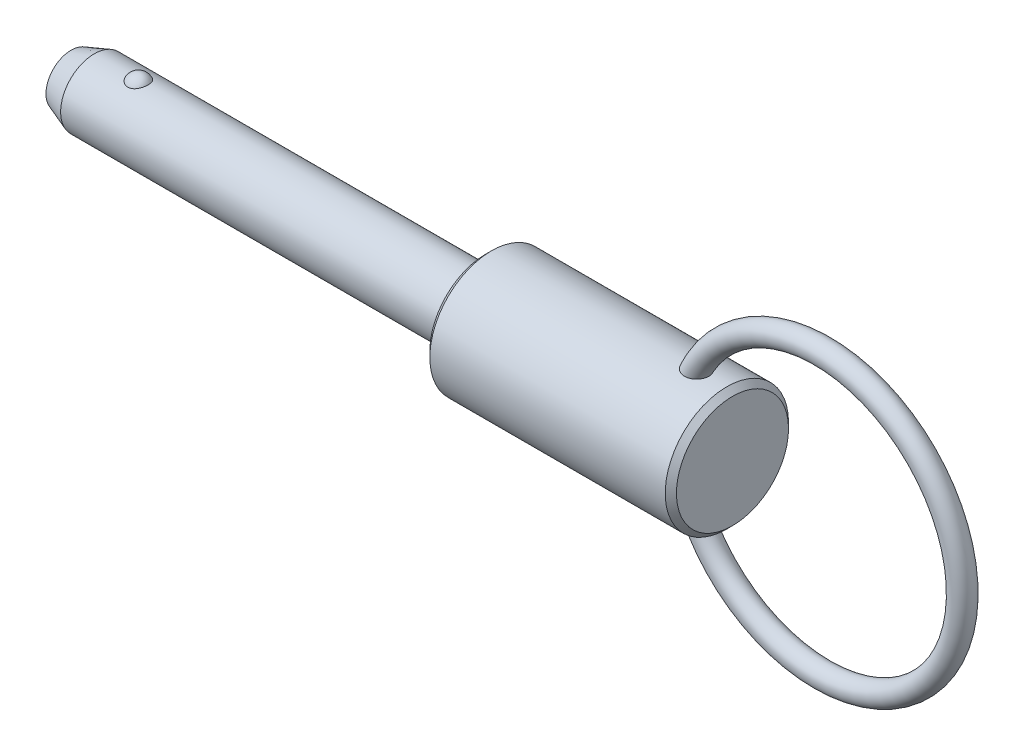
ISO-10303-21;
HEADER;
FILE_DESCRIPTION(('STEP AP214'),'2;1');
FILE_NAME('part.step','',(''),(''),'','','');
FILE_SCHEMA(('AUTOMOTIVE_DESIGN { 1 0 10303 214 1 1 1 1 }'));
ENDSEC;
DATA;
#1=APPLICATION_CONTEXT('core data for automotive mechanical design processes');
#2=APPLICATION_PROTOCOL_DEFINITION('international standard','automotive_design',2000,#1);
#3=PRODUCT_CONTEXT('',#1,'mechanical');
#4=PRODUCT('Part','Part','',(#3));
#5=PRODUCT_RELATED_PRODUCT_CATEGORY('part','',(#4));
#6=PRODUCT_DEFINITION_FORMATION('','',#4);
#7=PRODUCT_DEFINITION_CONTEXT('part definition',#1,'design');
#8=PRODUCT_DEFINITION('design','',#6,#7);
#9=PRODUCT_DEFINITION_SHAPE('','',#8);
#10=(LENGTH_UNIT() NAMED_UNIT(*) SI_UNIT(.MILLI.,.METRE.));
#11=(NAMED_UNIT(*) PLANE_ANGLE_UNIT() SI_UNIT($,.RADIAN.));
#12=(NAMED_UNIT(*) SI_UNIT($,.STERADIAN.) SOLID_ANGLE_UNIT());
#13=UNCERTAINTY_MEASURE_WITH_UNIT(LENGTH_MEASURE(1.E-05),#10,'distance_accuracy_value','');
#14=(GEOMETRIC_REPRESENTATION_CONTEXT(3) GLOBAL_UNCERTAINTY_ASSIGNED_CONTEXT((#13)) GLOBAL_UNIT_ASSIGNED_CONTEXT((#10,
#11,#12)) REPRESENTATION_CONTEXT('',''));
#15=CARTESIAN_POINT('',(0.,0.,0.));
#16=DIRECTION('',(0.,0.,1.));
#17=DIRECTION('',(1.,0.,0.));
#18=AXIS2_PLACEMENT_3D('',#15,#16,#17);
#19=CARTESIAN_POINT('',(-37.,0.,0.));
#20=DIRECTION('',(1.,0.,0.));
#21=DIRECTION('',(0.,0.,-1.));
#22=AXIS2_PLACEMENT_3D('',#19,#20,#21);
#23=PLANE('',#22);
#24=CARTESIAN_POINT('',(-37.,0.,0.));
#25=DIRECTION('',(1.,0.,0.));
#26=DIRECTION('',(0.,0.,-1.));
#27=AXIS2_PLACEMENT_3D('',#24,#25,#26);
#28=CIRCLE('',#27,2.25);
#29=CARTESIAN_POINT('',(-37.,0.,-2.25));
#30=VERTEX_POINT('',#29);
#31=EDGE_CURVE('E65',#30,#30,#28,.T.);
#32=ORIENTED_EDGE('',*,*,#31,.F.);
#33=EDGE_LOOP('',(#32));
#34=FACE_BOUND('',#33,.T.);
#35=ADVANCED_FACE('F15',(#34),#23,.F.);
#36=CARTESIAN_POINT('',(-37.,0.,0.));
#37=DIRECTION('',(1.,0.,0.));
#38=DIRECTION('',(0.,0.,-1.));
#39=AXIS2_PLACEMENT_3D('',#36,#37,#38);
#40=CONICAL_SURFACE('',#39,2.25,0.349065850398866);
#41=CARTESIAN_POINT('',(-34.939391935409,0.,0.));
#42=DIRECTION('',(1.,0.,0.));
#43=DIRECTION('',(0.,0.,-1.));
#44=AXIS2_PLACEMENT_3D('',#41,#42,#43);
#45=CIRCLE('',#44,3.);
#46=CARTESIAN_POINT('',(-34.939391935409,0.,-3.));
#47=VERTEX_POINT('',#46);
#48=EDGE_CURVE('E85',#47,#47,#45,.T.);
#49=ORIENTED_EDGE('',*,*,#48,.F.);
#50=EDGE_LOOP('',(#49));
#51=FACE_BOUND('',#50,.T.);
#52=ORIENTED_EDGE('',*,*,#31,.T.);
#53=EDGE_LOOP('',(#52));
#54=FACE_BOUND('',#53,.T.);
#55=ADVANCED_FACE('F72',(#51,#54),#40,.T.);
#56=CARTESIAN_POINT('',(22.,0.,0.));
#57=DIRECTION('',(1.,0.,0.));
#58=DIRECTION('',(0.,0.,-1.));
#59=AXIS2_PLACEMENT_3D('',#56,#57,#58);
#60=CYLINDRICAL_SURFACE('',#59,2.99999999999999);
#61=CARTESIAN_POINT('',(0.,0.,0.));
#62=DIRECTION('',(1.,0.,0.));
#63=DIRECTION('',(0.,0.,-1.));
#64=AXIS2_PLACEMENT_3D('',#61,#62,#63);
#65=CIRCLE('',#64,2.99999999999999);
#66=CARTESIAN_POINT('',(0.,0.,-2.99999999999999));
#67=VERTEX_POINT('',#66);
#68=EDGE_CURVE('E88',#67,#67,#65,.T.);
#69=ORIENTED_EDGE('',*,*,#68,.F.);
#70=EDGE_LOOP('',(#69));
#71=FACE_BOUND('',#70,.T.);
#72=CARTESIAN_POINT('',(-30.1339745906775,3.00000000959214,0.));
#73=CARTESIAN_POINT('',(-30.1339750053791,2.9999995944216,0.0546556941744972));
#74=CARTESIAN_POINT('',(-30.1382914700072,2.99849333498199,0.109316280803024));
#75=CARTESIAN_POINT('',(-30.1555039485116,2.99262007211818,0.21711923146495));
#76=CARTESIAN_POINT('',(-30.1684010618357,2.98825270209795,0.270261400031665));
#77=CARTESIAN_POINT('',(-30.2026150718712,2.97710614168701,0.373550581541127));
#78=CARTESIAN_POINT('',(-30.2239387204412,2.97032501768161,0.423695155441631));
#79=CARTESIAN_POINT('',(-30.2746900711123,2.95508653269725,0.519436838880394));
#80=CARTESIAN_POINT('',(-30.304117643963,2.94662919845294,0.565034020929694));
#81=CARTESIAN_POINT('',(-30.3699167443118,2.92918923042513,0.649362280163123));
#82=CARTESIAN_POINT('',(-30.4061432870326,2.92021988571971,0.688208891821342));
#83=CARTESIAN_POINT('',(-30.4851370742032,2.90270603776341,0.758695973504806));
#84=CARTESIAN_POINT('',(-30.5279017612583,2.89416137012429,0.790339249121105));
#85=CARTESIAN_POINT('',(-30.6159001251152,2.87914525485122,0.843347824649814));
#86=CARTESIAN_POINT('',(-30.6607959901828,2.87257555352632,0.865244914041042));
#87=CARTESIAN_POINT('',(-30.7540272111864,2.86166763399681,0.900669880151301));
#88=CARTESIAN_POINT('',(-30.8023602655013,2.85732793825144,0.914203299617403));
#89=CARTESIAN_POINT('',(-30.8967277912867,2.85172521704145,0.931524947820183));
#90=CARTESIAN_POINT('',(-30.942617748336,2.85023576891202,0.936031835526619));
#91=CARTESIAN_POINT('',(-31.0345112899869,2.84981653903875,0.937308412830565));
#92=CARTESIAN_POINT('',(-31.0805148393949,2.85088604474412,0.934080256281315));
#93=CARTESIAN_POINT('',(-31.1692890768876,2.85535381963262,0.920327176845055));
#94=CARTESIAN_POINT('',(-31.2121142200525,2.85865173738214,0.910116467638252));
#95=CARTESIAN_POINT('',(-31.2954338999548,2.86710877203614,0.883111513672596));
#96=CARTESIAN_POINT('',(-31.3359282429099,2.87226804343491,0.866316722417971));
#97=CARTESIAN_POINT('',(-31.4147639017471,2.88408568704135,0.826134741283313));
#98=CARTESIAN_POINT('',(-31.4530088942255,2.89078314885841,0.802570708679964));
#99=CARTESIAN_POINT('',(-31.5252373414934,2.90491342081509,0.749814962675869));
#100=CARTESIAN_POINT('',(-31.5592195483145,2.91234644516318,0.720621607557689));
#101=CARTESIAN_POINT('',(-31.6246969338646,2.92781879655962,0.655051104135957));
#102=CARTESIAN_POINT('',(-31.6558169126497,2.93586195112418,0.618300304487188));
#103=CARTESIAN_POINT('',(-31.7119569342204,2.95121857838955,0.54026900265083));
#104=CARTESIAN_POINT('',(-31.7369749141895,2.95853180384132,0.498986975474903));
#105=CARTESIAN_POINT('',(-31.7821772502052,2.97225023631706,0.409767203659309));
#106=CARTESIAN_POINT('',(-31.8018692985568,2.97854875732738,0.361563151799722));
#107=CARTESIAN_POINT('',(-31.8335554590063,2.98891265626127,0.262459506454354));
#108=CARTESIAN_POINT('',(-31.8455477478094,2.99297750522093,0.211559277603451));
#109=CARTESIAN_POINT('',(-31.8620256560821,2.99860316224474,0.106191704710897));
#110=CARTESIAN_POINT('',(-31.8661705717197,3.00005020332463,0.0516646976416152));
#111=CARTESIAN_POINT('',(-31.8658724173204,2.99994708794779,-0.0573660149424486));
#112=CARTESIAN_POINT('',(-31.8614283663492,2.99839658914612,-0.111869717084521));
#113=CARTESIAN_POINT('',(-31.8439016686346,2.99241846258719,-0.219996872006711));
#114=CARTESIAN_POINT('',(-31.8307145779712,2.98795605966148,-0.273601547322453));
#115=CARTESIAN_POINT('',(-31.7957783112632,2.97659185196214,-0.37768042702198));
#116=CARTESIAN_POINT('',(-31.7740288162463,2.96968995631191,-0.428154514701981));
#117=CARTESIAN_POINT('',(-31.7225896996851,2.95429672937307,-0.523886449065424));
#118=CARTESIAN_POINT('',(-31.6929913007223,2.9458239755012,-0.569196175080012));
#119=CARTESIAN_POINT('',(-31.6262645690132,2.92821962933075,-0.653755879708987));
#120=CARTESIAN_POINT('',(-31.5891376081686,2.91908815726297,-0.693006960075907));
#121=CARTESIAN_POINT('',(-31.5099916175044,2.90171998578332,-0.762395005785717));
#122=CARTESIAN_POINT('',(-31.4682682521748,2.89346150984316,-0.792862852763761));
#123=CARTESIAN_POINT('',(-31.3797473534622,2.87845153618806,-0.845740147289689));
#124=CARTESIAN_POINT('',(-31.3329530062858,2.87169910026007,-0.868154617172233));
#125=CARTESIAN_POINT('',(-31.239669030662,2.86108896201611,-0.902478872841711));
#126=CARTESIAN_POINT('',(-31.1934589173828,2.85704178982365,-0.915089802305874));
#127=CARTESIAN_POINT('',(-31.0994073428664,2.85153527427126,-0.932110214040542));
#128=CARTESIAN_POINT('',(-31.0515667118005,2.85007463347342,-0.936523808255621));
#129=CARTESIAN_POINT('',(-30.9591789314336,2.84993586716271,-0.936943725244825));
#130=CARTESIAN_POINT('',(-30.9146334908143,2.85107177911227,-0.933511925705544));
#131=CARTESIAN_POINT('',(-30.8268016085039,2.85561380167588,-0.91952333626896));
#132=CARTESIAN_POINT('',(-30.7835150833149,2.85901976136854,-0.908967020035979));
#133=CARTESIAN_POINT('',(-30.6995917793594,2.86769808851366,-0.881201323396597));
#134=CARTESIAN_POINT('',(-30.6589425975189,2.87296083556654,-0.864026194882744));
#135=CARTESIAN_POINT('',(-30.5810012703915,2.88480769677917,-0.823605734622696));
#136=CARTESIAN_POINT('',(-30.5437098173805,2.89139208252677,-0.800359154938061));
#137=CARTESIAN_POINT('',(-30.4711732990588,2.90565300407081,-0.746983865442031));
#138=CARTESIAN_POINT('',(-30.436173407141,2.91337078777866,-0.716533515357295));
#139=CARTESIAN_POINT('',(-30.3713954047132,2.92881842594569,-0.650516297594288));
#140=CARTESIAN_POINT('',(-30.3416191382468,2.93654828369958,-0.614947631082182));
#141=CARTESIAN_POINT('',(-30.2855857069046,2.95190787721405,-0.536613439802808));
#142=CARTESIAN_POINT('',(-30.2597986368692,2.95948045497296,-0.49350017208257));
#143=CARTESIAN_POINT('',(-30.2152140119985,2.97307818702587,-0.403577282580501));
#144=CARTESIAN_POINT('',(-30.1964180543582,2.97910298761637,-0.356766819092164));
#145=CARTESIAN_POINT('',(-30.1655489542011,2.98921218505116,-0.259038696968963));
#146=CARTESIAN_POINT('',(-30.1537209465465,2.99322516155505,-0.208036124101786));
#147=CARTESIAN_POINT('',(-30.1379330079436,2.99861945936319,-0.104690656227778));
#148=CARTESIAN_POINT('',(-30.1339741934889,3.00000040722995,-0.0523475720940664));
#149=CARTESIAN_POINT('',(-30.1339745906775,3.00000000959214,0.));
#150=B_SPLINE_CURVE_WITH_KNOTS('',3,(#72,#73,#74,#75,#76,#77,#78,#79,#80,#81,#82,#83,#84,#85,
#86,#87,#88,#89,#90,#91,#92,#93,#94,#95,#96,#97,#98,#99,#100,#101,#102,#103,#104,#105,#106,#107,
#108,#109,#110,#111,#112,#113,#114,#115,#116,#117,#118,#119,#120,#121,#122,#123,#124,#125,#126,
#127,#128,#129,#130,#131,#132,#133,#134,#135,#136,#137,#138,#139,#140,#141,#142,#143,#144,#145,
#146,#147,#148,#149),.UNSPECIFIED.,.T.,.F.,(4,2,2,2,2,2,2,2,2,2,2,2,2,2,2,2,2,2,2,2,2,2,2,2,2,2,
2,2,2,2,2,2,2,2,2,2,2,2,4),(0.,0.163785355165934,0.327591700365777,0.491529564285775,
0.655464813694653,0.816236011830846,0.976944484456546,1.12727418310441,1.27750414855494,
1.41520408070461,1.55286567422718,1.68470810398031,1.81656147931252,1.95223361796468,
2.08794538360678,2.23379114271613,2.37968613771523,2.53633667034829,2.69302428398779,
2.85637129236827,3.01973695749006,3.18509021613309,3.35044963520636,3.51396556723361,
3.67745172909704,3.83357427790288,3.98959929417632,4.13304691443797,4.27642255909792,
4.40985399458822,4.54327655993505,4.67601774867752,4.80878624281575,4.94927684273089,
5.08981693925024,5.24156625698256,5.39335022221986,5.55019663350437,5.7070652968156),.UNSPECIFIED.);
#151=CARTESIAN_POINT('',(-30.1339745906775,3.00000000959214,0.));
#152=VERTEX_POINT('',#151);
#153=EDGE_CURVE('E27',#152,#152,#150,.T.);
#154=ORIENTED_EDGE('',*,*,#153,.T.);
#155=EDGE_LOOP('',(#154));
#156=FACE_BOUND('',#155,.T.);
#157=CARTESIAN_POINT('',(-31.8660254093225,-3.00000000959215,0.));
#158=CARTESIAN_POINT('',(-31.8660249946209,-2.9999995944216,0.0546556941744971));
#159=CARTESIAN_POINT('',(-31.8617085299928,-2.99849333498199,0.109316280803024));
#160=CARTESIAN_POINT('',(-31.8444960514884,-2.99262007211818,0.21711923146495));
#161=CARTESIAN_POINT('',(-31.8315989381644,-2.98825270209795,0.270261400031665));
#162=CARTESIAN_POINT('',(-31.7973849281288,-2.97710614168701,0.373550581541126));
#163=CARTESIAN_POINT('',(-31.7760612795588,-2.97032501768161,0.423695155441629));
#164=CARTESIAN_POINT('',(-31.7253099288877,-2.95508653269725,0.519436838880391));
#165=CARTESIAN_POINT('',(-31.695882356037,-2.94662919845294,0.565034020929692));
#166=CARTESIAN_POINT('',(-31.6300832556882,-2.92918923042513,0.649362280163121));
#167=CARTESIAN_POINT('',(-31.5938567129674,-2.92021988571971,0.688208891821339));
#168=CARTESIAN_POINT('',(-31.5148629257968,-2.90270603776341,0.758695973504805));
#169=CARTESIAN_POINT('',(-31.4720982387417,-2.89416137012429,0.790339249121104));
#170=CARTESIAN_POINT('',(-31.3840998748848,-2.87914525485122,0.843347824649813));
#171=CARTESIAN_POINT('',(-31.3392040098172,-2.87257555352632,0.865244914041041));
#172=CARTESIAN_POINT('',(-31.2459727888136,-2.86166763399681,0.9006698801513));
#173=CARTESIAN_POINT('',(-31.1976397344987,-2.85732793825144,0.914203299617401));
#174=CARTESIAN_POINT('',(-31.1032722087133,-2.85172521704145,0.931524947820181));
#175=CARTESIAN_POINT('',(-31.057382251664,-2.85023576891202,0.936031835526618));
#176=CARTESIAN_POINT('',(-30.9654887100131,-2.84981653903875,0.937308412830563));
#177=CARTESIAN_POINT('',(-30.9194851606051,-2.85088604474412,0.934080256281314));
#178=CARTESIAN_POINT('',(-30.8307109231124,-2.85535381963262,0.920327176845054));
#179=CARTESIAN_POINT('',(-30.7878857799475,-2.85865173738214,0.910116467638252));
#180=CARTESIAN_POINT('',(-30.7045661000452,-2.86710877203614,0.883111513672596));
#181=CARTESIAN_POINT('',(-30.6640717570901,-2.87226804343492,0.86631672241797));
#182=CARTESIAN_POINT('',(-30.5852360982529,-2.88408568704135,0.826134741283308));
#183=CARTESIAN_POINT('',(-30.5469911057745,-2.89078314885841,0.802570708679958));
#184=CARTESIAN_POINT('',(-30.4747626585066,-2.90491342081509,0.749814962675865));
#185=CARTESIAN_POINT('',(-30.4407804516855,-2.91234644516318,0.720621607557687));
#186=CARTESIAN_POINT('',(-30.3753030661354,-2.92781879655962,0.655051104135957));
#187=CARTESIAN_POINT('',(-30.3441830873503,-2.93586195112418,0.618300304487187));
#188=CARTESIAN_POINT('',(-30.2880430657796,-2.95121857838955,0.540269002650831));
#189=CARTESIAN_POINT('',(-30.2630250858105,-2.95853180384132,0.498986975474904));
#190=CARTESIAN_POINT('',(-30.2178227497949,-2.97225023631706,0.409767203659311));
#191=CARTESIAN_POINT('',(-30.1981307014432,-2.97854875732738,0.361563151799723));
#192=CARTESIAN_POINT('',(-30.1664445409937,-2.98891265626127,0.262459506454354));
#193=CARTESIAN_POINT('',(-30.1544522521906,-2.99297750522093,0.211559277603449));
#194=CARTESIAN_POINT('',(-30.1379743439179,-2.99860316224474,0.106191704710894));
#195=CARTESIAN_POINT('',(-30.1338294282803,-3.00005020332463,0.0516646976416128));
#196=CARTESIAN_POINT('',(-30.1341275826796,-2.99994708794779,-0.0573660149424496));
#197=CARTESIAN_POINT('',(-30.1385716336508,-2.99839658914612,-0.111869717084521));
#198=CARTESIAN_POINT('',(-30.1560983313654,-2.99241846258719,-0.219996872006712));
#199=CARTESIAN_POINT('',(-30.1692854220288,-2.98795605966148,-0.273601547322454));
#200=CARTESIAN_POINT('',(-30.2042216887368,-2.97659185196214,-0.37768042702198));
#201=CARTESIAN_POINT('',(-30.2259711837537,-2.96968995631191,-0.428154514701981));
#202=CARTESIAN_POINT('',(-30.2774103003149,-2.95429672937307,-0.523886449065423));
#203=CARTESIAN_POINT('',(-30.3070086992777,-2.9458239755012,-0.569196175080011));
#204=CARTESIAN_POINT('',(-30.3737354309868,-2.92821962933075,-0.653755879708987));
#205=CARTESIAN_POINT('',(-30.4108623918314,-2.91908815726297,-0.693006960075907));
#206=CARTESIAN_POINT('',(-30.4900083824956,-2.90171998578332,-0.762395005785716));
#207=CARTESIAN_POINT('',(-30.5317317478252,-2.89346150984317,-0.792862852763758));
#208=CARTESIAN_POINT('',(-30.6202526465378,-2.87845153618806,-0.845740147289686));
#209=CARTESIAN_POINT('',(-30.6670469937142,-2.87169910026007,-0.868154617172232));
#210=CARTESIAN_POINT('',(-30.760330969338,-2.86108896201611,-0.90247887284171));
#211=CARTESIAN_POINT('',(-30.8065410826172,-2.85704178982366,-0.915089802305873));
#212=CARTESIAN_POINT('',(-30.9005926571336,-2.85153527427126,-0.932110214040541));
#213=CARTESIAN_POINT('',(-30.9484332881995,-2.85007463347342,-0.936523808255621));
#214=CARTESIAN_POINT('',(-31.0408210685664,-2.84993586716271,-0.936943725244824));
#215=CARTESIAN_POINT('',(-31.0853665091857,-2.85107177911227,-0.933511925705543));
#216=CARTESIAN_POINT('',(-31.1731983914961,-2.85561380167588,-0.91952333626896));
#217=CARTESIAN_POINT('',(-31.2164849166851,-2.85901976136854,-0.90896702003598));
#218=CARTESIAN_POINT('',(-31.3004082206406,-2.86769808851366,-0.881201323396598));
#219=CARTESIAN_POINT('',(-31.3410574024811,-2.87296083556654,-0.864026194882745));
#220=CARTESIAN_POINT('',(-31.4189987296085,-2.88480769677917,-0.823605734622697));
#221=CARTESIAN_POINT('',(-31.4562901826195,-2.89139208252677,-0.800359154938062));
#222=CARTESIAN_POINT('',(-31.5288267009412,-2.90565300407081,-0.74698386544203));
#223=CARTESIAN_POINT('',(-31.563826592859,-2.91337078777866,-0.716533515357294));
#224=CARTESIAN_POINT('',(-31.6286045952868,-2.92881842594569,-0.650516297594287));
#225=CARTESIAN_POINT('',(-31.6583808617532,-2.93654828369958,-0.614947631082182));
#226=CARTESIAN_POINT('',(-31.7144142930954,-2.95190787721405,-0.536613439802808));
#227=CARTESIAN_POINT('',(-31.7402013631308,-2.95948045497296,-0.49350017208257));
#228=CARTESIAN_POINT('',(-31.7847859880015,-2.97307818702587,-0.403577282580501));
#229=CARTESIAN_POINT('',(-31.8035819456418,-2.97910298761637,-0.356766819092165));
#230=CARTESIAN_POINT('',(-31.8344510457989,-2.98921218505116,-0.259038696968963));
#231=CARTESIAN_POINT('',(-31.8462790534535,-2.99322516155505,-0.208036124101786));
#232=CARTESIAN_POINT('',(-31.8620669920564,-2.99861945936319,-0.104690656227778));
#233=CARTESIAN_POINT('',(-31.8660258065111,-3.00000040722995,-0.0523475720940664));
#234=CARTESIAN_POINT('',(-31.8660254093225,-3.00000000959215,0.));
#235=B_SPLINE_CURVE_WITH_KNOTS('',3,(#157,#158,#159,#160,#161,#162,#163,#164,#165,#166,#167,
#168,#169,#170,#171,#172,#173,#174,#175,#176,#177,#178,#179,#180,#181,#182,#183,#184,#185,#186,
#187,#188,#189,#190,#191,#192,#193,#194,#195,#196,#197,#198,#199,#200,#201,#202,#203,#204,#205,
#206,#207,#208,#209,#210,#211,#212,#213,#214,#215,#216,#217,#218,#219,#220,#221,#222,#223,#224,
#225,#226,#227,#228,#229,#230,#231,#232,#233,#234),.UNSPECIFIED.,.T.,.F.,(4,2,2,2,2,2,2,2,2,2,2,
2,2,2,2,2,2,2,2,2,2,2,2,2,2,2,2,2,2,2,2,2,2,2,2,2,2,2,4),(0.,0.163785355165934,
0.327591700365776,0.491529564285771,0.655464813694655,0.816236011830842,0.976944484456546,
1.12727418310441,1.27750414855493,1.41520408070461,1.55286567422718,1.68470810398031,
1.81656147931253,1.95223361796468,2.08794538360678,2.23379114271613,2.37968613771523,
2.53633667034829,2.69302428398779,2.85637129236827,3.01973695749006,3.18509021613309,
3.35044963520635,3.5139655672336,3.67745172909704,3.83357427790287,3.98959929417632,
4.13304691443797,4.27642255909792,4.40985399458821,4.54327655993505,4.6760177486775,
4.80878624281575,4.94927684273089,5.08981693925023,5.24156625698255,5.39335022221986,
5.55019663350436,5.7070652968156),.UNSPECIFIED.);
#236=CARTESIAN_POINT('',(-31.8660254093225,-3.00000000959215,0.));
#237=VERTEX_POINT('',#236);
#238=EDGE_CURVE('E31',#237,#237,#235,.T.);
#239=ORIENTED_EDGE('',*,*,#238,.T.);
#240=EDGE_LOOP('',(#239));
#241=FACE_BOUND('',#240,.T.);
#242=ORIENTED_EDGE('',*,*,#48,.T.);
#243=EDGE_LOOP('',(#242));
#244=FACE_BOUND('',#243,.T.);
#245=ADVANCED_FACE('F67',(#71,#156,#241,#244),#60,.T.);
#246=CARTESIAN_POINT('',(0.,2.99999999999999,0.));
#247=DIRECTION('',(1.,0.,0.));
#248=DIRECTION('',(0.,0.,-1.));
#249=AXIS2_PLACEMENT_3D('',#246,#247,#248);
#250=PLANE('',#249);
#251=CARTESIAN_POINT('',(0.,0.,0.));
#252=DIRECTION('',(1.,0.,0.));
#253=DIRECTION('',(0.,0.,-1.));
#254=AXIS2_PLACEMENT_3D('',#251,#252,#253);
#255=CIRCLE('',#254,5.);
#256=CARTESIAN_POINT('',(0.,0.,-5.));
#257=VERTEX_POINT('',#256);
#258=EDGE_CURVE('E91',#257,#257,#255,.T.);
#259=ORIENTED_EDGE('',*,*,#258,.F.);
#260=EDGE_LOOP('',(#259));
#261=FACE_BOUND('',#260,.T.);
#262=ORIENTED_EDGE('',*,*,#68,.T.);
#263=EDGE_LOOP('',(#262));
#264=FACE_BOUND('',#263,.T.);
#265=ADVANCED_FACE('F71',(#261,#264),#250,.F.);
#266=CARTESIAN_POINT('',(0.,0.,0.));
#267=DIRECTION('',(1.,0.,0.));
#268=DIRECTION('',(0.,0.,-1.));
#269=AXIS2_PLACEMENT_3D('',#266,#267,#268);
#270=CONICAL_SURFACE('',#269,5.,0.785398163397448);
#271=CARTESIAN_POINT('',(0.5,0.,0.));
#272=DIRECTION('',(1.,0.,0.));
#273=DIRECTION('',(0.,0.,-1.));
#274=AXIS2_PLACEMENT_3D('',#271,#272,#273);
#275=CIRCLE('',#274,5.50000000000001);
#276=CARTESIAN_POINT('',(0.5,0.,-5.50000000000001));
#277=VERTEX_POINT('',#276);
#278=EDGE_CURVE('E96',#277,#277,#275,.T.);
#279=ORIENTED_EDGE('',*,*,#278,.F.);
#280=EDGE_LOOP('',(#279));
#281=FACE_BOUND('',#280,.T.);
#282=ORIENTED_EDGE('',*,*,#258,.T.);
#283=EDGE_LOOP('',(#282));
#284=FACE_BOUND('',#283,.T.);
#285=ADVANCED_FACE('F113',(#281,#284),#270,.T.);
#286=CARTESIAN_POINT('',(22.,0.,0.));
#287=DIRECTION('',(1.,0.,0.));
#288=DIRECTION('',(0.,0.,-1.));
#289=AXIS2_PLACEMENT_3D('',#286,#287,#288);
#290=CYLINDRICAL_SURFACE('',#289,5.50000000000001);
#291=CARTESIAN_POINT('',(21.5,0.,0.));
#292=DIRECTION('',(1.,0.,0.));
#293=DIRECTION('',(0.,0.,-1.));
#294=AXIS2_PLACEMENT_3D('',#291,#292,#293);
#295=CIRCLE('',#294,5.50000000000001);
#296=CARTESIAN_POINT('',(21.5,0.,-5.50000000000001));
#297=VERTEX_POINT('',#296);
#298=EDGE_CURVE('E99',#297,#297,#295,.T.);
#299=ORIENTED_EDGE('',*,*,#298,.F.);
#300=EDGE_LOOP('',(#299));
#301=FACE_BOUND('',#300,.T.);
#302=CARTESIAN_POINT('',(17.750576124359,5.48634349152937,-0.38734364301544));
#303=CARTESIAN_POINT('',(17.7724494349483,5.48274154866302,-0.438357640137109));
#304=CARTESIAN_POINT('',(17.798668567357,5.4785525524463,-0.487483688327103));
#305=CARTESIAN_POINT('',(17.8590299594161,5.4694756467688,-0.580541854920455));
#306=CARTESIAN_POINT('',(17.8931756825596,5.46458743214665,-0.624471690155701));
#307=CARTESIAN_POINT('',(17.9683099143467,5.45466697302774,-0.70589789342224));
#308=CARTESIAN_POINT('',(18.0092899351852,5.4496349135229,-0.743402125981354));
#309=CARTESIAN_POINT('',(18.0968786737983,5.43996231872068,-0.811162804638974));
#310=CARTESIAN_POINT('',(18.1434871106382,5.4353217639015,-0.841419612258238));
#311=CARTESIAN_POINT('',(18.2421105372392,5.42679822878332,-0.894768686166552));
#312=CARTESIAN_POINT('',(18.2942262946674,5.42293544887474,-0.917677331965627));
#313=CARTESIAN_POINT('',(18.4014435412949,5.4164636995353,-0.955135020489946));
#314=CARTESIAN_POINT('',(18.4565458544062,5.41385507807288,-0.969681743403903));
#315=CARTESIAN_POINT('',(18.5722273435309,5.40995502488563,-0.991220020264031));
#316=CARTESIAN_POINT('',(18.6329205954058,5.40876805092958,-0.99761444233566));
#317=CARTESIAN_POINT('',(18.7545811789755,5.40809020130652,-1.00127963963812));
#318=CARTESIAN_POINT('',(18.8155486054129,5.40859996553908,-0.998546972721703));
#319=CARTESIAN_POINT('',(18.9425436318609,5.41132152718038,-0.983699181838359));
#320=CARTESIAN_POINT('',(19.0084603559652,5.41370003528318,-0.970664275558046));
#321=CARTESIAN_POINT('',(19.1374924418164,5.42002873610976,-0.934675827152841));
#322=CARTESIAN_POINT('',(19.2006052302796,5.42398034070659,-0.91171337333744));
#323=CARTESIAN_POINT('',(19.327290704899,5.43335165529882,-0.854170884119264));
#324=CARTESIAN_POINT('',(19.3905080756305,5.43886248446503,-0.818818253791183));
#325=CARTESIAN_POINT('',(19.5097319710671,5.45046910774747,-0.737606330369384));
#326=CARTESIAN_POINT('',(19.5657458997128,5.45656428981111,-0.691757962147159));
#327=CARTESIAN_POINT('',(19.6560295212159,5.46710170420007,-0.601944176615336));
#328=CARTESIAN_POINT('',(19.6923264561249,5.47159865768816,-0.560021123578729));
#329=CARTESIAN_POINT('',(19.7576306788024,5.4799995738883,-0.470753432652418));
#330=CARTESIAN_POINT('',(19.7866427283685,5.4839039232949,-0.423412365891546));
#331=CARTESIAN_POINT('',(19.835927081516,5.4906936596261,-0.323720807116122));
#332=CARTESIAN_POINT('',(19.85611921474,5.4935696581054,-0.271329441235914));
#333=CARTESIAN_POINT('',(19.8857365745399,5.49783138637197,-0.163530455476579));
#334=CARTESIAN_POINT('',(19.8951749896126,5.49921894148264,-0.108126617736612));
#335=CARTESIAN_POINT('',(19.9018848665892,5.50020403180955,-0.00482993919980251));
#336=CARTESIAN_POINT('',(19.9007490037099,5.50003590642648,0.0429621901150518));
#337=CARTESIAN_POINT('',(19.8901369344187,5.49848232962586,0.137583127917937));
#338=CARTESIAN_POINT('',(19.8806614176962,5.49709697887289,0.184412015738327));
#339=CARTESIAN_POINT('',(19.854625046861,5.49335968722632,0.273699233533154));
#340=CARTESIAN_POINT('',(19.8384007778908,5.49105384986016,0.316259380209258));
#341=CARTESIAN_POINT('',(19.7998050270622,5.48570455304717,0.39842584112971));
#342=CARTESIAN_POINT('',(19.7774319205093,5.48266089867359,0.438031371160288));
#343=CARTESIAN_POINT('',(19.7246002733669,5.47570905278642,0.518079175558995));
#344=CARTESIAN_POINT('',(19.6935087653994,5.47174174648511,0.558096619940841));
#345=CARTESIAN_POINT('',(19.6260404659049,5.4635430635632,0.633350452424869));
#346=CARTESIAN_POINT('',(19.5896605098613,5.45931152970433,0.668583953309771));
#347=CARTESIAN_POINT('',(19.5054126926911,5.45010923035343,0.740166401350183));
#348=CARTESIAN_POINT('',(19.4566695798711,5.44514852439301,0.775487235921069));
#349=CARTESIAN_POINT('',(19.3545753848554,5.4357581882853,0.838783222313806));
#350=CARTESIAN_POINT('',(19.3012210504649,5.43132893830814,0.866753132572306));
#351=CARTESIAN_POINT('',(19.1823928334966,5.42277510469245,0.91886765507821));
#352=CARTESIAN_POINT('',(19.1163340803812,5.41880853756857,0.941714776276455));
#353=CARTESIAN_POINT('',(18.9813138736454,5.41263001804249,0.976601887449956));
#354=CARTESIAN_POINT('',(18.9123512236494,5.41041879642179,0.988637376624974));
#355=CARTESIAN_POINT('',(18.7708041240367,5.40806833955867,1.00142205122411));
#356=CARTESIAN_POINT('',(18.6981786537159,5.40800654244239,1.00174943589848));
#357=CARTESIAN_POINT('',(18.554086364393,5.41030166387512,0.989282346328382));
#358=CARTESIAN_POINT('',(18.4826188712261,5.412657119658,0.97649580779054));
#359=CARTESIAN_POINT('',(18.3492989357993,5.4192784563542,0.939013401920904));
#360=CARTESIAN_POINT('',(18.2871392971181,5.42337109928982,0.915384619576006));
#361=CARTESIAN_POINT('',(18.1684457778527,5.43291458137856,0.856919323326918));
#362=CARTESIAN_POINT('',(18.1119078541874,5.43836443440801,0.822090941516082));
#363=CARTESIAN_POINT('',(18.0122358526942,5.44926060443399,0.746233077641603));
#364=CARTESIAN_POINT('',(17.9683199779696,5.45464880953473,0.706219664470983));
#365=CARTESIAN_POINT('',(17.8883781647286,5.46523880724,0.618942382076453));
#366=CARTESIAN_POINT('',(17.8523493803514,5.47044066651428,0.571681138554509));
#367=CARTESIAN_POINT('',(17.7912551516919,5.47971600676406,0.474300568444975));
#368=CARTESIAN_POINT('',(17.7656720480603,5.48383766525545,0.424509686931923));
#369=CARTESIAN_POINT('',(17.723339024805,5.49085541006646,0.32121942166441));
#370=CARTESIAN_POINT('',(17.7065886067414,5.49375156554094,0.267720247366497));
#371=CARTESIAN_POINT('',(17.6826387583634,5.49794277869324,0.159663117116605));
#372=CARTESIAN_POINT('',(17.6752601541762,5.49926783926482,0.105145903025839));
#373=CARTESIAN_POINT('',(17.6696605518557,5.50027039008781,-0.00435530517894576));
#374=CARTESIAN_POINT('',(17.671435308539,5.49994864410248,-0.0593390711029633));
#375=CARTESIAN_POINT('',(17.683223695835,5.49784986479384,-0.160842726424567));
#376=CARTESIAN_POINT('',(17.6920930646858,5.4962751005022,-0.207503402354855));
#377=CARTESIAN_POINT('',(17.7164479838765,5.49205687897892,-0.299014424335847));
#378=CARTESIAN_POINT('',(17.7319336421921,5.48941340430632,-0.343864740829028));
#379=CARTESIAN_POINT('',(17.750576124359,5.48634349152937,-0.38734364301544));
#380=B_SPLINE_CURVE_WITH_KNOTS('',3,(#302,#303,#304,#305,#306,#307,#308,#309,#310,#311,#312,
#313,#314,#315,#316,#317,#318,#319,#320,#321,#322,#323,#324,#325,#326,#327,#328,#329,#330,#331,
#332,#333,#334,#335,#336,#337,#338,#339,#340,#341,#342,#343,#344,#345,#346,#347,#348,#349,#350,
#351,#352,#353,#354,#355,#356,#357,#358,#359,#360,#361,#362,#363,#364,#365,#366,#367,#368,#369,
#370,#371,#372,#373,#374,#375,#376,#377,#378,#379),.UNSPECIFIED.,.T.,.F.,(4,2,2,2,2,2,2,2,2,2,2,
2,2,2,2,2,2,2,2,2,2,2,2,2,2,2,2,2,2,2,2,2,2,2,2,2,2,2,4),(0.,0.166692790309874,
0.333458553939869,0.500018725735143,0.666570587336684,0.837008167881501,1.00749300937878,
1.18985828364493,1.3722923420541,1.57315286193928,1.77419406447107,1.99107011292631,
2.20772143628454,2.37398171864613,2.54013303966215,2.70776469731569,2.87519054732634,
3.01786049647347,3.16051864792219,3.29678311999867,3.43308363162774,3.58501369105011,
3.73703503992922,3.91754255335467,4.09817843025887,4.30728129482124,4.51647116703155,
4.73319008136538,4.94977792862348,5.14853533689361,5.34714875091841,5.52518843127067,
5.70316376414474,5.87073799533671,6.03830276908696,6.20261323003978,6.36684749326409,
6.50891636950823,6.65098756435652),.UNSPECIFIED.);
#381=CARTESIAN_POINT('',(17.750576124359,5.48634349152937,-0.38734364301544));
#382=VERTEX_POINT('',#381);
#383=EDGE_CURVE('E10',#382,#382,#380,.T.);
#384=ORIENTED_EDGE('',*,*,#383,.T.);
#385=EDGE_LOOP('',(#384));
#386=FACE_BOUND('',#385,.T.);
#387=CARTESIAN_POINT('',(17.750576124359,-5.48634349152937,-0.38734364301544));
#388=CARTESIAN_POINT('',(17.7290939005615,-5.48988067362355,-0.337238017064364));
#389=CARTESIAN_POINT('',(17.7117971832634,-5.49285243876954,-0.285293584579909));
#390=CARTESIAN_POINT('',(17.6860515827026,-5.49733672557057,-0.179186912476447));
#391=CARTESIAN_POINT('',(17.6776042825028,-5.49884898613256,-0.125024277845681));
#392=CARTESIAN_POINT('',(17.6697894284925,-5.50024663797638,-0.0160269600685613));
#393=CARTESIAN_POINT('',(17.6704218079981,-5.50013204120631,0.0388077181391547));
#394=CARTESIAN_POINT('',(17.6807493015172,-5.49828861929241,0.147586956389541));
#395=CARTESIAN_POINT('',(17.6904440853809,-5.49655985295391,0.201531548785809));
#396=CARTESIAN_POINT('',(17.7186237202468,-5.49168090486253,0.306961368776073));
#397=CARTESIAN_POINT('',(17.7371018756274,-5.48853180593185,0.358448436913075));
#398=CARTESIAN_POINT('',(17.7823347958778,-5.48115955372128,0.457561045141235));
#399=CARTESIAN_POINT('',(17.8090893442438,-5.47693642853756,0.505186686203088));
#400=CARTESIAN_POINT('',(17.870247751946,-5.46785878438405,0.595475758009164));
#401=CARTESIAN_POINT('',(17.9046842538725,-5.46300160883842,0.638116793011375));
#402=CARTESIAN_POINT('',(17.9801279083967,-5.45319676996638,0.717100148687873));
#403=CARTESIAN_POINT('',(18.0211352147157,-5.44824910452538,0.753442321961436));
#404=CARTESIAN_POINT('',(18.1093479894352,-5.43868865656998,0.81963959756394));
#405=CARTESIAN_POINT('',(18.1566561661537,-5.43408399444091,0.849358754939975));
#406=CARTESIAN_POINT('',(18.255454428023,-5.42577695359039,0.900904138869716));
#407=CARTESIAN_POINT('',(18.3069452836311,-5.42207474160673,0.922728907206313));
#408=CARTESIAN_POINT('',(18.4153917580249,-5.41574385047403,0.959208735638045));
#409=CARTESIAN_POINT('',(18.4724921126268,-5.41317929339791,0.973443042052851));
#410=CARTESIAN_POINT('',(18.5882265354321,-5.40960458140713,0.993114661229161));
#411=CARTESIAN_POINT('',(18.6468611642454,-5.40859500296672,0.998548711526967));
#412=CARTESIAN_POINT('',(18.7695971039904,-5.40813295729947,1.00105040189851));
#413=CARTESIAN_POINT('',(18.8337148614523,-5.40882901737035,0.997319922295367));
#414=CARTESIAN_POINT('',(18.9606299132457,-5.41193388678035,0.980327713121076));
#415=CARTESIAN_POINT('',(19.0234266102374,-5.41434345447199,0.9670617633786));
#416=CARTESIAN_POINT('',(19.1524350637735,-5.42088180376624,0.929750622340865));
#417=CARTESIAN_POINT('',(19.2183701295968,-5.42515707644054,0.904768928775136));
#418=CARTESIAN_POINT('',(19.3453135258433,-5.43487480967685,0.844433019475008));
#419=CARTESIAN_POINT('',(19.4063166229842,-5.4403184882181,0.809067965569569));
#420=CARTESIAN_POINT('',(19.5228267289755,-5.45185170789624,0.727366108174053));
#421=CARTESIAN_POINT('',(19.5781542083735,-5.45795416644442,0.680772828142778));
#422=CARTESIAN_POINT('',(19.6786861594267,-5.4698197131416,0.57770170170322));
#423=CARTESIAN_POINT('',(19.7239155390489,-5.47558360988991,0.521248802685964));
#424=CARTESIAN_POINT('',(19.7886992637662,-5.48417660555829,0.418978910425003));
#425=CARTESIAN_POINT('',(19.8118482964948,-5.48735700898489,0.375456864586482));
#426=CARTESIAN_POINT('',(19.8506881987874,-5.49278898135121,0.285144410886741));
#427=CARTESIAN_POINT('',(19.8663862346913,-5.49504144250568,0.2383571933497));
#428=CARTESIAN_POINT('',(19.8893740183894,-5.4983656270033,0.142432814707224));
#429=CARTESIAN_POINT('',(19.896619115609,-5.49943107893956,0.0932845898476243));
#430=CARTESIAN_POINT('',(19.9019867294569,-5.50021880874901,-0.00552155763542596));
#431=CARTESIAN_POINT('',(19.9001110284886,-5.49994134905654,-0.0551793787799884));
#432=CARTESIAN_POINT('',(19.8879335658766,-5.49816110600741,-0.149168594802946));
#433=CARTESIAN_POINT('',(19.8783500883967,-5.49676280891227,-0.193597964463579));
#434=CARTESIAN_POINT('',(19.8522631697708,-5.49302342283862,-0.280320363305109));
#435=CARTESIAN_POINT('',(19.8357584528019,-5.4906821600422,-0.322612997000643));
#436=CARTESIAN_POINT('',(19.7957322794172,-5.48514667862487,-0.40621176399712));
#437=CARTESIAN_POINT('',(19.7719079923134,-5.48191644382045,-0.447369304587104));
#438=CARTESIAN_POINT('',(19.7186530262389,-5.47494950425796,-0.525815466490565));
#439=CARTESIAN_POINT('',(19.6892198111763,-5.47121257061599,-0.56310232583871));
#440=CARTESIAN_POINT('',(19.6204722397595,-5.46287637009337,-0.639284361219789));
#441=CARTESIAN_POINT('',(19.5803287542718,-5.45823669884499,-0.67742567222604));
#442=CARTESIAN_POINT('',(19.4950767663145,-5.44905653917178,-0.747689839776356));
#443=CARTESIAN_POINT('',(19.44996489947,-5.44451612048116,-0.779808577820476));
#444=CARTESIAN_POINT('',(19.3471402361979,-5.43509397783066,-0.843186972637576));
#445=CARTESIAN_POINT('',(19.2886403121554,-5.43030453790823,-0.873188153013841));
#446=CARTESIAN_POINT('',(19.1677022978459,-5.42187772002936,-0.924070939256887));
#447=CARTESIAN_POINT('',(19.1052616249292,-5.41824110720322,-0.944946491920879));
#448=CARTESIAN_POINT('',(18.9714409415205,-5.41225272326247,-0.978697766681169));
#449=CARTESIAN_POINT('',(18.8997933356931,-5.41006688847914,-0.990558179302096));
#450=CARTESIAN_POINT('',(18.7554670078808,-5.40799041514769,-1.00183640377162));
#451=CARTESIAN_POINT('',(18.6827884229944,-5.40809947423372,-1.00125585479031));
#452=CARTESIAN_POINT('',(18.541312374092,-5.41068728880082,-0.98717394016315));
#453=CARTESIAN_POINT('',(18.4724688324704,-5.41308158098857,-0.974133094450057));
#454=CARTESIAN_POINT('',(18.3385202617556,-5.41990298336526,-0.935433731565717));
#455=CARTESIAN_POINT('',(18.2734123932337,-5.42432852597249,-0.909784943270458));
#456=CARTESIAN_POINT('',(18.1562512748909,-5.43406792126327,-0.849544617381937));
#457=CARTESIAN_POINT('',(18.1035461388546,-5.43923706153865,-0.816195703376568));
#458=CARTESIAN_POINT('',(18.0052305587909,-5.45007243639889,-0.740383462262362));
#459=CARTESIAN_POINT('',(17.9596145131164,-5.45573827291032,-0.697927395230348));
#460=CARTESIAN_POINT('',(17.8836190698721,-5.46593949079551,-0.612419308770543));
#461=CARTESIAN_POINT('',(17.8519731415557,-5.4705135108706,-0.570489737872278));
#462=CARTESIAN_POINT('',(17.795786417966,-5.4790138846105,-0.482054711087679));
#463=CARTESIAN_POINT('',(17.7712441471855,-5.48294037270178,-0.435550208157469));
#464=CARTESIAN_POINT('',(17.750576124359,-5.48634349152937,-0.38734364301544));
#465=B_SPLINE_CURVE_WITH_KNOTS('',3,(#387,#388,#389,#390,#391,#392,#393,#394,#395,#396,#397,
#398,#399,#400,#401,#402,#403,#404,#405,#406,#407,#408,#409,#410,#411,#412,#413,#414,#415,#416,
#417,#418,#419,#420,#421,#422,#423,#424,#425,#426,#427,#428,#429,#430,#431,#432,#433,#434,#435,
#436,#437,#438,#439,#440,#441,#442,#443,#444,#445,#446,#447,#448,#449,#450,#451,#452,#453,#454,
#455,#456,#457,#458,#459,#460,#461,#462,#463,#464),.UNSPECIFIED.,.T.,.F.,(4,2,2,2,2,2,2,2,2,2,2,
2,2,2,2,2,2,2,2,2,2,2,2,2,2,2,2,2,2,2,2,2,2,2,2,2,2,2,4),(0.,0.163706911607204,
0.327443103574007,0.491178093015704,0.654907117708892,0.818511530368836,0.982111663631031,
1.14642068596746,1.31073355280797,1.47815940452212,1.64561616663548,1.82158348952813,
1.99761603276048,2.18951273287958,2.38149441422854,2.59246761145192,2.80366181056893,
3.020234391944,3.23626672419296,3.38387150778108,3.53133403653721,3.67957202301345,
3.82778104171061,3.96358696134323,4.09941792569635,4.24187037655342,4.38438739115565,
4.55047430201398,4.71667437945468,4.91362515618517,5.11070637661546,5.32760198680863,
5.54446901990128,5.75361888099531,5.96260760506036,6.14934910144963,6.33594228010391,
6.49347725687271,6.65097948838457),.UNSPECIFIED.);
#466=CARTESIAN_POINT('',(17.750576124359,-5.48634349152937,-0.38734364301544));
#467=VERTEX_POINT('',#466);
#468=EDGE_CURVE('E18',#467,#467,#465,.T.);
#469=ORIENTED_EDGE('',*,*,#468,.T.);
#470=EDGE_LOOP('',(#469));
#471=FACE_BOUND('',#470,.T.);
#472=ORIENTED_EDGE('',*,*,#278,.T.);
#473=EDGE_LOOP('',(#472));
#474=FACE_BOUND('',#473,.T.);
#475=ADVANCED_FACE('F42',(#301,#386,#471,#474),#290,.T.);
#476=CARTESIAN_POINT('',(21.5,0.,0.));
#477=DIRECTION('',(-1.,0.,0.));
#478=DIRECTION('',(0.,0.,1.));
#479=AXIS2_PLACEMENT_3D('',#476,#477,#478);
#480=CONICAL_SURFACE('',#479,5.50000000000001,0.785398163397448);
#481=CARTESIAN_POINT('',(22.,0.,0.));
#482=DIRECTION('',(1.,0.,0.));
#483=DIRECTION('',(0.,0.,-1.));
#484=AXIS2_PLACEMENT_3D('',#481,#482,#483);
#485=CIRCLE('',#484,5.00000000000001);
#486=CARTESIAN_POINT('',(22.,0.,-5.00000000000001));
#487=VERTEX_POINT('',#486);
#488=EDGE_CURVE('E102',#487,#487,#485,.T.);
#489=ORIENTED_EDGE('',*,*,#488,.F.);
#490=EDGE_LOOP('',(#489));
#491=FACE_BOUND('',#490,.T.);
#492=ORIENTED_EDGE('',*,*,#298,.T.);
#493=EDGE_LOOP('',(#492));
#494=FACE_BOUND('',#493,.T.);
#495=ADVANCED_FACE('F112',(#491,#494),#480,.T.);
#496=CARTESIAN_POINT('',(22.,5.00000000000001,0.));
#497=DIRECTION('',(-1.,0.,0.));
#498=DIRECTION('',(0.,0.,1.));
#499=AXIS2_PLACEMENT_3D('',#496,#497,#498);
#500=PLANE('',#499);
#501=ORIENTED_EDGE('',*,*,#488,.T.);
#502=EDGE_LOOP('',(#501));
#503=FACE_BOUND('',#502,.T.);
#504=ADVANCED_FACE('F56',(#503),#500,.F.);
#505=CARTESIAN_POINT('',(-31.,-2.49999999999999,0.));
#506=DIRECTION('',(0.,-1.,0.));
#507=DIRECTION('',(1.,0.,0.));
#508=AXIS2_PLACEMENT_3D('',#505,#506,#507);
#509=SPHERICAL_SURFACE('',#508,1.);
#510=ORIENTED_EDGE('',*,*,#238,.F.);
#511=EDGE_LOOP('',(#510));
#512=FACE_BOUND('',#511,.T.);
#513=ADVANCED_FACE('F52',(#512),#509,.T.);
#514=CARTESIAN_POINT('',(-31.,2.49999999999999,0.));
#515=DIRECTION('',(0.,-1.,0.));
#516=DIRECTION('',(1.,0.,0.));
#517=AXIS2_PLACEMENT_3D('',#514,#515,#516);
#518=SPHERICAL_SURFACE('',#517,1.00000000000001);
#519=ORIENTED_EDGE('',*,*,#153,.F.);
#520=EDGE_LOOP('',(#519));
#521=FACE_BOUND('',#520,.T.);
#522=ADVANCED_FACE('F50',(#521),#518,.T.);
#523=CARTESIAN_POINT('',(30.,0.,0.));
#524=DIRECTION('',(0.,0.,-1.));
#525=DIRECTION('',(-1.,0.,0.));
#526=AXIS2_PLACEMENT_3D('',#523,#524,#525);
#527=TOROIDAL_SURFACE('',#526,12.5,1.);
#528=ORIENTED_EDGE('',*,*,#383,.F.);
#529=EDGE_LOOP('',(#528));
#530=FACE_BOUND('',#529,.T.);
#531=ORIENTED_EDGE('',*,*,#468,.F.);
#532=EDGE_LOOP('',(#531));
#533=FACE_BOUND('',#532,.T.);
#534=ADVANCED_FACE('F46',(#530,#533),#527,.T.);
#535=CLOSED_SHELL('',(#35,#55,#245,#265,#285,#475,#495,#504,#513,#522,#534));
#536=MANIFOLD_SOLID_BREP('B1',#535);
#537=ADVANCED_BREP_SHAPE_REPRESENTATION('',(#18,#536),#14);
#538=SHAPE_DEFINITION_REPRESENTATION(#9,#537);
ENDSEC;
END-ISO-10303-21;
